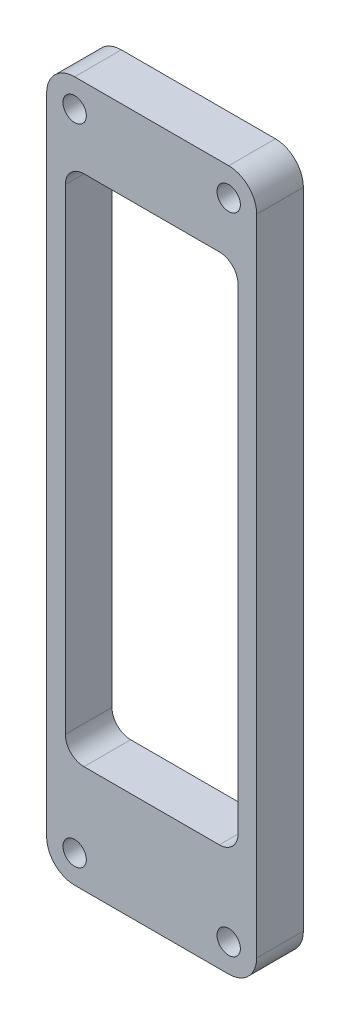
ISO-10303-21;
HEADER;
FILE_DESCRIPTION(('STEP AP214'),'2;1');
FILE_NAME('part.step','',(''),(''),'','','');
FILE_SCHEMA(('AUTOMOTIVE_DESIGN { 1 0 10303 214 1 1 1 1 }'));
ENDSEC;
DATA;
#1=APPLICATION_CONTEXT('core data for automotive mechanical design processes');
#2=APPLICATION_PROTOCOL_DEFINITION('international standard','automotive_design',2000,#1);
#3=PRODUCT_CONTEXT('',#1,'mechanical');
#4=PRODUCT('Part','Part','',(#3));
#5=PRODUCT_RELATED_PRODUCT_CATEGORY('part','',(#4));
#6=PRODUCT_DEFINITION_FORMATION('','',#4);
#7=PRODUCT_DEFINITION_CONTEXT('part definition',#1,'design');
#8=PRODUCT_DEFINITION('design','',#6,#7);
#9=PRODUCT_DEFINITION_SHAPE('','',#8);
#10=(LENGTH_UNIT() NAMED_UNIT(*) SI_UNIT(.MILLI.,.METRE.));
#11=(NAMED_UNIT(*) PLANE_ANGLE_UNIT() SI_UNIT($,.RADIAN.));
#12=(NAMED_UNIT(*) SI_UNIT($,.STERADIAN.) SOLID_ANGLE_UNIT());
#13=UNCERTAINTY_MEASURE_WITH_UNIT(LENGTH_MEASURE(1.E-05),#10,'distance_accuracy_value','');
#14=(GEOMETRIC_REPRESENTATION_CONTEXT(3) GLOBAL_UNCERTAINTY_ASSIGNED_CONTEXT((#13)) GLOBAL_UNIT_ASSIGNED_CONTEXT((#10,
#11,#12)) REPRESENTATION_CONTEXT('',''));
#15=CARTESIAN_POINT('',(0.,0.,0.));
#16=DIRECTION('',(0.,0.,1.));
#17=DIRECTION('',(1.,0.,0.));
#18=AXIS2_PLACEMENT_3D('',#15,#16,#17);
#19=CARTESIAN_POINT('',(13.7368421052632,-33.8684210526316,10.));
#20=DIRECTION('',(0.,0.,-1.));
#21=DIRECTION('',(-1.,0.,0.));
#22=AXIS2_PLACEMENT_3D('',#19,#20,#21);
#23=PLANE('',#22);
#24=DIRECTION('',(1.,0.,0.));
#25=VECTOR('',#24,1.);
#26=CARTESIAN_POINT('',(-17.2631578947368,-16.8684210526316,10.));
#27=LINE('',#26,#25);
#28=CARTESIAN_POINT('',(-17.2631578947368,-16.8684210526316,10.));
#29=VERTEX_POINT('',#28);
#30=CARTESIAN_POINT('',(11.7368421052631,-16.8684210526316,10.));
#31=VERTEX_POINT('',#30);
#32=EDGE_CURVE('E203',#29,#31,#27,.T.);
#33=ORIENTED_EDGE('',*,*,#32,.F.);
#34=CARTESIAN_POINT('',(-17.2631578947368,-12.8684210526316,10.));
#35=DIRECTION('',(0.,0.,1.));
#36=DIRECTION('',(1.,0.,0.));
#37=AXIS2_PLACEMENT_3D('',#34,#35,#36);
#38=CIRCLE('',#37,4.);
#39=CARTESIAN_POINT('',(-21.2631578947368,-12.8684210526315,10.));
#40=VERTEX_POINT('',#39);
#41=EDGE_CURVE('E55',#40,#29,#38,.T.);
#42=ORIENTED_EDGE('',*,*,#41,.F.);
#43=DIRECTION('',(0.,-1.,0.));
#44=VECTOR('',#43,1.);
#45=CARTESIAN_POINT('',(-21.2631578947368,89.1315789473684,10.));
#46=LINE('',#45,#44);
#47=CARTESIAN_POINT('',(-21.2631578947368,89.1315789473684,10.));
#48=VERTEX_POINT('',#47);
#49=EDGE_CURVE('E175',#48,#40,#46,.T.);
#50=ORIENTED_EDGE('',*,*,#49,.F.);
#51=CARTESIAN_POINT('',(-17.2631578947368,89.1315789473684,10.));
#52=DIRECTION('',(0.,0.,1.));
#53=DIRECTION('',(-1.,0.,0.));
#54=AXIS2_PLACEMENT_3D('',#51,#52,#53);
#55=CIRCLE('',#54,4.);
#56=CARTESIAN_POINT('',(-17.2631578947368,93.1315789473684,10.));
#57=VERTEX_POINT('',#56);
#58=EDGE_CURVE('E179',#57,#48,#55,.T.);
#59=ORIENTED_EDGE('',*,*,#58,.F.);
#60=DIRECTION('',(-1.,0.,0.));
#61=VECTOR('',#60,1.);
#62=CARTESIAN_POINT('',(-17.2631578947368,93.1315789473684,10.));
#63=LINE('',#62,#61);
#64=CARTESIAN_POINT('',(11.7368421052631,93.1315789473684,10.));
#65=VERTEX_POINT('',#64);
#66=EDGE_CURVE('E218',#65,#57,#63,.T.);
#67=ORIENTED_EDGE('',*,*,#66,.F.);
#68=CARTESIAN_POINT('',(11.7368421052632,89.1315789473684,10.));
#69=DIRECTION('',(0.,0.,1.));
#70=DIRECTION('',(1.,0.,0.));
#71=AXIS2_PLACEMENT_3D('',#68,#69,#70);
#72=CIRCLE('',#71,4.);
#73=CARTESIAN_POINT('',(15.7368421052632,89.1315789473684,10.));
#74=VERTEX_POINT('',#73);
#75=EDGE_CURVE('E214',#74,#65,#72,.T.);
#76=ORIENTED_EDGE('',*,*,#75,.F.);
#77=DIRECTION('',(0.,1.,0.));
#78=VECTOR('',#77,1.);
#79=CARTESIAN_POINT('',(15.7368421052632,89.1315789473684,10.));
#80=LINE('',#79,#78);
#81=CARTESIAN_POINT('',(15.7368421052632,-12.8684210526315,10.));
#82=VERTEX_POINT('',#81);
#83=EDGE_CURVE('E210',#82,#74,#80,.T.);
#84=ORIENTED_EDGE('',*,*,#83,.F.);
#85=CARTESIAN_POINT('',(11.7368421052632,-12.8684210526316,10.));
#86=DIRECTION('',(0.,0.,1.));
#87=DIRECTION('',(1.,0.,0.));
#88=AXIS2_PLACEMENT_3D('',#85,#86,#87);
#89=CIRCLE('',#88,4.);
#90=EDGE_CURVE('E206',#31,#82,#89,.T.);
#91=ORIENTED_EDGE('',*,*,#90,.F.);
#92=EDGE_LOOP('',(#33,#42,#50,#59,#67,#76,#84,#91));
#93=FACE_BOUND('',#92,.T.);
#94=CARTESIAN_POINT('',(13.7368421052632,-33.8684210526316,10.));
#95=DIRECTION('',(0.,0.,1.));
#96=DIRECTION('',(-1.,0.,0.));
#97=AXIS2_PLACEMENT_3D('',#94,#95,#96);
#98=CIRCLE('',#97,6.);
#99=CARTESIAN_POINT('',(13.7368421052631,-39.8684210526316,10.));
#100=VERTEX_POINT('',#99);
#101=CARTESIAN_POINT('',(19.7368421052632,-33.8684210526315,10.));
#102=VERTEX_POINT('',#101);
#103=EDGE_CURVE('E278',#100,#102,#98,.T.);
#104=ORIENTED_EDGE('',*,*,#103,.T.);
#105=DIRECTION('',(0.,1.,0.));
#106=VECTOR('',#105,1.);
#107=CARTESIAN_POINT('',(19.7368421052631,104.131578947368,10.));
#108=LINE('',#107,#106);
#109=CARTESIAN_POINT('',(19.7368421052631,104.131578947368,10.));
#110=VERTEX_POINT('',#109);
#111=EDGE_CURVE('E282',#102,#110,#108,.T.);
#112=ORIENTED_EDGE('',*,*,#111,.T.);
#113=CARTESIAN_POINT('',(13.7368421052631,104.131578947368,10.));
#114=DIRECTION('',(0.,0.,1.));
#115=DIRECTION('',(1.,0.,0.));
#116=AXIS2_PLACEMENT_3D('',#113,#114,#115);
#117=CIRCLE('',#116,6.);
#118=CARTESIAN_POINT('',(13.7368421052631,110.131578947368,10.));
#119=VERTEX_POINT('',#118);
#120=EDGE_CURVE('E286',#110,#119,#117,.T.);
#121=ORIENTED_EDGE('',*,*,#120,.T.);
#122=DIRECTION('',(-1.,0.,0.));
#123=VECTOR('',#122,1.);
#124=CARTESIAN_POINT('',(-19.2631578947368,110.131578947368,10.));
#125=LINE('',#124,#123);
#126=CARTESIAN_POINT('',(-19.2631578947368,110.131578947368,10.));
#127=VERTEX_POINT('',#126);
#128=EDGE_CURVE('E289',#119,#127,#125,.T.);
#129=ORIENTED_EDGE('',*,*,#128,.T.);
#130=CARTESIAN_POINT('',(-19.2631578947368,104.131578947368,10.));
#131=DIRECTION('',(0.,0.,1.));
#132=DIRECTION('',(1.,0.,0.));
#133=AXIS2_PLACEMENT_3D('',#130,#131,#132);
#134=CIRCLE('',#133,6.);
#135=CARTESIAN_POINT('',(-25.2631578947368,104.131578947368,10.));
#136=VERTEX_POINT('',#135);
#137=EDGE_CURVE('E292',#127,#136,#134,.T.);
#138=ORIENTED_EDGE('',*,*,#137,.T.);
#139=DIRECTION('',(0.,-1.,0.));
#140=VECTOR('',#139,1.);
#141=CARTESIAN_POINT('',(-25.2631578947368,104.131578947368,10.));
#142=LINE('',#141,#140);
#143=CARTESIAN_POINT('',(-25.2631578947368,-33.8684210526315,10.));
#144=VERTEX_POINT('',#143);
#145=EDGE_CURVE('E295',#136,#144,#142,.T.);
#146=ORIENTED_EDGE('',*,*,#145,.T.);
#147=CARTESIAN_POINT('',(-19.2631578947368,-33.8684210526316,10.));
#148=DIRECTION('',(0.,0.,1.));
#149=DIRECTION('',(-1.,0.,0.));
#150=AXIS2_PLACEMENT_3D('',#147,#148,#149);
#151=CIRCLE('',#150,6.);
#152=CARTESIAN_POINT('',(-19.2631578947368,-39.8684210526316,10.));
#153=VERTEX_POINT('',#152);
#154=EDGE_CURVE('E298',#144,#153,#151,.T.);
#155=ORIENTED_EDGE('',*,*,#154,.T.);
#156=DIRECTION('',(1.,0.,0.));
#157=VECTOR('',#156,1.);
#158=CARTESIAN_POINT('',(-19.2631578947368,-39.8684210526316,10.));
#159=LINE('',#158,#157);
#160=EDGE_CURVE('E301',#153,#100,#159,.T.);
#161=ORIENTED_EDGE('',*,*,#160,.T.);
#162=EDGE_LOOP('',(#104,#112,#121,#129,#138,#146,#155,#161));
#163=FACE_BOUND('',#162,.T.);
#164=CARTESIAN_POINT('',(-19.2631578947368,104.131578947368,10.));
#165=DIRECTION('',(0.,0.,1.));
#166=DIRECTION('',(1.,0.,0.));
#167=AXIS2_PLACEMENT_3D('',#164,#165,#166);
#168=CIRCLE('',#167,2.5);
#169=CARTESIAN_POINT('',(-16.7631578947368,104.131578947368,10.));
#170=VERTEX_POINT('',#169);
#171=EDGE_CURVE('E270',#170,#170,#168,.T.);
#172=ORIENTED_EDGE('',*,*,#171,.F.);
#173=EDGE_LOOP('',(#172));
#174=FACE_BOUND('',#173,.T.);
#175=CARTESIAN_POINT('',(13.7368421052631,104.131578947368,10.));
#176=DIRECTION('',(0.,0.,1.));
#177=DIRECTION('',(1.,0.,0.));
#178=AXIS2_PLACEMENT_3D('',#175,#176,#177);
#179=CIRCLE('',#178,2.5);
#180=CARTESIAN_POINT('',(16.2368421052631,104.131578947368,10.));
#181=VERTEX_POINT('',#180);
#182=EDGE_CURVE('E262',#181,#181,#179,.T.);
#183=ORIENTED_EDGE('',*,*,#182,.F.);
#184=EDGE_LOOP('',(#183));
#185=FACE_BOUND('',#184,.T.);
#186=CARTESIAN_POINT('',(-19.2631578947368,-33.8684210526316,10.));
#187=DIRECTION('',(0.,0.,1.));
#188=DIRECTION('',(1.,0.,0.));
#189=AXIS2_PLACEMENT_3D('',#186,#187,#188);
#190=CIRCLE('',#189,2.5);
#191=CARTESIAN_POINT('',(-16.7631578947368,-33.8684210526316,10.));
#192=VERTEX_POINT('',#191);
#193=EDGE_CURVE('E254',#192,#192,#190,.T.);
#194=ORIENTED_EDGE('',*,*,#193,.F.);
#195=EDGE_LOOP('',(#194));
#196=FACE_BOUND('',#195,.T.);
#197=CARTESIAN_POINT('',(13.7368421052632,-33.8684210526316,10.));
#198=DIRECTION('',(0.,0.,1.));
#199=DIRECTION('',(1.,0.,0.));
#200=AXIS2_PLACEMENT_3D('',#197,#198,#199);
#201=CIRCLE('',#200,2.5);
#202=CARTESIAN_POINT('',(16.2368421052632,-33.8684210526316,10.));
#203=VERTEX_POINT('',#202);
#204=EDGE_CURVE('E246',#203,#203,#201,.T.);
#205=ORIENTED_EDGE('',*,*,#204,.F.);
#206=EDGE_LOOP('',(#205));
#207=FACE_BOUND('',#206,.T.);
#208=ADVANCED_FACE('F39',(#93,#163,#174,#185,#196,#207),#23,.F.);
#209=CARTESIAN_POINT('',(13.7368421052632,-33.8684210526316,0.));
#210=DIRECTION('',(0.,0.,-1.));
#211=DIRECTION('',(-1.,0.,0.));
#212=AXIS2_PLACEMENT_3D('',#209,#210,#211);
#213=PLANE('',#212);
#214=CARTESIAN_POINT('',(-17.2631578947368,-12.8684210526316,0.));
#215=DIRECTION('',(0.,0.,1.));
#216=DIRECTION('',(1.,0.,0.));
#217=AXIS2_PLACEMENT_3D('',#214,#215,#216);
#218=CIRCLE('',#217,4.);
#219=CARTESIAN_POINT('',(-21.2631578947368,-12.8684210526315,0.));
#220=VERTEX_POINT('',#219);
#221=CARTESIAN_POINT('',(-17.2631578947368,-16.8684210526316,0.));
#222=VERTEX_POINT('',#221);
#223=EDGE_CURVE('E155',#220,#222,#218,.T.);
#224=ORIENTED_EDGE('',*,*,#223,.T.);
#225=DIRECTION('',(1.,0.,0.));
#226=VECTOR('',#225,1.);
#227=CARTESIAN_POINT('',(-17.2631578947368,-16.8684210526316,0.));
#228=LINE('',#227,#226);
#229=CARTESIAN_POINT('',(11.7368421052631,-16.8684210526316,0.));
#230=VERTEX_POINT('',#229);
#231=EDGE_CURVE('E165',#222,#230,#228,.T.);
#232=ORIENTED_EDGE('',*,*,#231,.T.);
#233=CARTESIAN_POINT('',(11.7368421052632,-12.8684210526316,0.));
#234=DIRECTION('',(0.,0.,1.));
#235=DIRECTION('',(1.,0.,0.));
#236=AXIS2_PLACEMENT_3D('',#233,#234,#235);
#237=CIRCLE('',#236,4.);
#238=CARTESIAN_POINT('',(15.7368421052632,-12.8684210526315,0.));
#239=VERTEX_POINT('',#238);
#240=EDGE_CURVE('E63',#230,#239,#237,.T.);
#241=ORIENTED_EDGE('',*,*,#240,.T.);
#242=DIRECTION('',(0.,1.,0.));
#243=VECTOR('',#242,1.);
#244=CARTESIAN_POINT('',(15.7368421052632,89.1315789473684,0.));
#245=LINE('',#244,#243);
#246=CARTESIAN_POINT('',(15.7368421052632,89.1315789473684,0.));
#247=VERTEX_POINT('',#246);
#248=EDGE_CURVE('E184',#239,#247,#245,.T.);
#249=ORIENTED_EDGE('',*,*,#248,.T.);
#250=CARTESIAN_POINT('',(11.7368421052632,89.1315789473684,0.));
#251=DIRECTION('',(0.,0.,1.));
#252=DIRECTION('',(1.,0.,0.));
#253=AXIS2_PLACEMENT_3D('',#250,#251,#252);
#254=CIRCLE('',#253,4.);
#255=CARTESIAN_POINT('',(11.7368421052631,93.1315789473684,0.));
#256=VERTEX_POINT('',#255);
#257=EDGE_CURVE('E188',#247,#256,#254,.T.);
#258=ORIENTED_EDGE('',*,*,#257,.T.);
#259=DIRECTION('',(-1.,0.,0.));
#260=VECTOR('',#259,1.);
#261=CARTESIAN_POINT('',(-17.2631578947368,93.1315789473684,0.));
#262=LINE('',#261,#260);
#263=CARTESIAN_POINT('',(-17.2631578947368,93.1315789473684,0.));
#264=VERTEX_POINT('',#263);
#265=EDGE_CURVE('E192',#256,#264,#262,.T.);
#266=ORIENTED_EDGE('',*,*,#265,.T.);
#267=CARTESIAN_POINT('',(-17.2631578947368,89.1315789473684,0.));
#268=DIRECTION('',(0.,0.,1.));
#269=DIRECTION('',(-1.,0.,0.));
#270=AXIS2_PLACEMENT_3D('',#267,#268,#269);
#271=CIRCLE('',#270,4.);
#272=CARTESIAN_POINT('',(-21.2631578947368,89.1315789473684,0.));
#273=VERTEX_POINT('',#272);
#274=EDGE_CURVE('E196',#264,#273,#271,.T.);
#275=ORIENTED_EDGE('',*,*,#274,.T.);
#276=DIRECTION('',(0.,-1.,0.));
#277=VECTOR('',#276,1.);
#278=CARTESIAN_POINT('',(-21.2631578947368,89.1315789473684,0.));
#279=LINE('',#278,#277);
#280=EDGE_CURVE('E162',#273,#220,#279,.T.);
#281=ORIENTED_EDGE('',*,*,#280,.T.);
#282=EDGE_LOOP('',(#224,#232,#241,#249,#258,#266,#275,#281));
#283=FACE_BOUND('',#282,.T.);
#284=CARTESIAN_POINT('',(-19.2631578947368,-33.8684210526316,0.));
#285=DIRECTION('',(0.,0.,1.));
#286=DIRECTION('',(1.,0.,0.));
#287=AXIS2_PLACEMENT_3D('',#284,#285,#286);
#288=CIRCLE('',#287,2.5);
#289=CARTESIAN_POINT('',(-16.7631578947368,-33.8684210526316,0.));
#290=VERTEX_POINT('',#289);
#291=EDGE_CURVE('E250',#290,#290,#288,.T.);
#292=ORIENTED_EDGE('',*,*,#291,.T.);
#293=EDGE_LOOP('',(#292));
#294=FACE_BOUND('',#293,.T.);
#295=CARTESIAN_POINT('',(-19.2631578947368,104.131578947368,0.));
#296=DIRECTION('',(0.,0.,1.));
#297=DIRECTION('',(1.,0.,0.));
#298=AXIS2_PLACEMENT_3D('',#295,#296,#297);
#299=CIRCLE('',#298,2.5);
#300=CARTESIAN_POINT('',(-16.7631578947368,104.131578947368,0.));
#301=VERTEX_POINT('',#300);
#302=EDGE_CURVE('E266',#301,#301,#299,.T.);
#303=ORIENTED_EDGE('',*,*,#302,.T.);
#304=EDGE_LOOP('',(#303));
#305=FACE_BOUND('',#304,.T.);
#306=CARTESIAN_POINT('',(13.7368421052632,-33.8684210526316,0.));
#307=DIRECTION('',(0.,0.,1.));
#308=DIRECTION('',(-1.,0.,0.));
#309=AXIS2_PLACEMENT_3D('',#306,#307,#308);
#310=CIRCLE('',#309,6.);
#311=CARTESIAN_POINT('',(13.7368421052631,-39.8684210526316,0.));
#312=VERTEX_POINT('',#311);
#313=CARTESIAN_POINT('',(19.7368421052632,-33.8684210526315,0.));
#314=VERTEX_POINT('',#313);
#315=EDGE_CURVE('E274',#312,#314,#310,.T.);
#316=ORIENTED_EDGE('',*,*,#315,.F.);
#317=DIRECTION('',(1.,0.,0.));
#318=VECTOR('',#317,1.);
#319=CARTESIAN_POINT('',(-19.2631578947368,-39.8684210526316,0.));
#320=LINE('',#319,#318);
#321=CARTESIAN_POINT('',(-19.2631578947368,-39.8684210526316,0.));
#322=VERTEX_POINT('',#321);
#323=EDGE_CURVE('E283',#322,#312,#320,.T.);
#324=ORIENTED_EDGE('',*,*,#323,.F.);
#325=CARTESIAN_POINT('',(-19.2631578947368,-33.8684210526316,0.));
#326=DIRECTION('',(0.,0.,1.));
#327=DIRECTION('',(-1.,0.,0.));
#328=AXIS2_PLACEMENT_3D('',#325,#326,#327);
#329=CIRCLE('',#328,6.);
#330=CARTESIAN_POINT('',(-25.2631578947368,-33.8684210526315,0.));
#331=VERTEX_POINT('',#330);
#332=EDGE_CURVE('E323',#331,#322,#329,.T.);
#333=ORIENTED_EDGE('',*,*,#332,.F.);
#334=DIRECTION('',(0.,-1.,0.));
#335=VECTOR('',#334,1.);
#336=CARTESIAN_POINT('',(-25.2631578947368,104.131578947368,0.));
#337=LINE('',#336,#335);
#338=CARTESIAN_POINT('',(-25.2631578947368,104.131578947368,0.));
#339=VERTEX_POINT('',#338);
#340=EDGE_CURVE('E320',#339,#331,#337,.T.);
#341=ORIENTED_EDGE('',*,*,#340,.F.);
#342=CARTESIAN_POINT('',(-19.2631578947368,104.131578947368,0.));
#343=DIRECTION('',(0.,0.,1.));
#344=DIRECTION('',(1.,0.,0.));
#345=AXIS2_PLACEMENT_3D('',#342,#343,#344);
#346=CIRCLE('',#345,6.);
#347=CARTESIAN_POINT('',(-19.2631578947368,110.131578947368,0.));
#348=VERTEX_POINT('',#347);
#349=EDGE_CURVE('E317',#348,#339,#346,.T.);
#350=ORIENTED_EDGE('',*,*,#349,.F.);
#351=DIRECTION('',(-1.,0.,0.));
#352=VECTOR('',#351,1.);
#353=CARTESIAN_POINT('',(-19.2631578947368,110.131578947368,0.));
#354=LINE('',#353,#352);
#355=CARTESIAN_POINT('',(13.7368421052631,110.131578947368,0.));
#356=VERTEX_POINT('',#355);
#357=EDGE_CURVE('E314',#356,#348,#354,.T.);
#358=ORIENTED_EDGE('',*,*,#357,.F.);
#359=CARTESIAN_POINT('',(13.7368421052631,104.131578947368,0.));
#360=DIRECTION('',(0.,0.,1.));
#361=DIRECTION('',(1.,0.,0.));
#362=AXIS2_PLACEMENT_3D('',#359,#360,#361);
#363=CIRCLE('',#362,6.);
#364=CARTESIAN_POINT('',(19.7368421052631,104.131578947368,0.));
#365=VERTEX_POINT('',#364);
#366=EDGE_CURVE('E311',#365,#356,#363,.T.);
#367=ORIENTED_EDGE('',*,*,#366,.F.);
#368=DIRECTION('',(0.,1.,0.));
#369=VECTOR('',#368,1.);
#370=CARTESIAN_POINT('',(19.7368421052631,104.131578947368,0.));
#371=LINE('',#370,#369);
#372=EDGE_CURVE('E308',#314,#365,#371,.T.);
#373=ORIENTED_EDGE('',*,*,#372,.F.);
#374=EDGE_LOOP('',(#316,#324,#333,#341,#350,#358,#367,#373));
#375=FACE_BOUND('',#374,.T.);
#376=CARTESIAN_POINT('',(13.7368421052631,104.131578947368,0.));
#377=DIRECTION('',(0.,0.,1.));
#378=DIRECTION('',(1.,0.,0.));
#379=AXIS2_PLACEMENT_3D('',#376,#377,#378);
#380=CIRCLE('',#379,2.5);
#381=CARTESIAN_POINT('',(16.2368421052631,104.131578947368,0.));
#382=VERTEX_POINT('',#381);
#383=EDGE_CURVE('E258',#382,#382,#380,.T.);
#384=ORIENTED_EDGE('',*,*,#383,.T.);
#385=EDGE_LOOP('',(#384));
#386=FACE_BOUND('',#385,.T.);
#387=CARTESIAN_POINT('',(13.7368421052632,-33.8684210526316,0.));
#388=DIRECTION('',(0.,0.,1.));
#389=DIRECTION('',(1.,0.,0.));
#390=AXIS2_PLACEMENT_3D('',#387,#388,#389);
#391=CIRCLE('',#390,2.5);
#392=CARTESIAN_POINT('',(16.2368421052632,-33.8684210526316,0.));
#393=VERTEX_POINT('',#392);
#394=EDGE_CURVE('E228',#393,#393,#391,.T.);
#395=ORIENTED_EDGE('',*,*,#394,.T.);
#396=EDGE_LOOP('',(#395));
#397=FACE_BOUND('',#396,.T.);
#398=ADVANCED_FACE('F170',(#283,#294,#305,#375,#386,#397),#213,.T.);
#399=CARTESIAN_POINT('',(13.7368421052632,-33.8684210526316,10.));
#400=DIRECTION('',(0.,0.,-1.));
#401=DIRECTION('',(-1.,0.,0.));
#402=AXIS2_PLACEMENT_3D('',#399,#400,#401);
#403=CYLINDRICAL_SURFACE('',#402,6.);
#404=ORIENTED_EDGE('',*,*,#315,.T.);
#405=DIRECTION('',(0.,0.,-1.));
#406=VECTOR('',#405,1.);
#407=CARTESIAN_POINT('',(19.7368421052632,-33.8684210526315,10.));
#408=LINE('',#407,#406);
#409=EDGE_CURVE('E11',#102,#314,#408,.T.);
#410=ORIENTED_EDGE('',*,*,#409,.F.);
#411=ORIENTED_EDGE('',*,*,#103,.F.);
#412=DIRECTION('',(0.,0.,-1.));
#413=VECTOR('',#412,1.);
#414=CARTESIAN_POINT('',(13.7368421052631,-39.8684210526316,10.));
#415=LINE('',#414,#413);
#416=EDGE_CURVE('E304',#100,#312,#415,.T.);
#417=ORIENTED_EDGE('',*,*,#416,.T.);
#418=EDGE_LOOP('',(#404,#410,#411,#417));
#419=FACE_BOUND('',#418,.T.);
#420=ADVANCED_FACE('F41',(#419),#403,.T.);
#421=CARTESIAN_POINT('',(19.7368421052631,104.131578947368,10.));
#422=DIRECTION('',(-1.,0.,0.));
#423=DIRECTION('',(0.,-1.,0.));
#424=AXIS2_PLACEMENT_3D('',#421,#422,#423);
#425=PLANE('',#424);
#426=ORIENTED_EDGE('',*,*,#372,.T.);
#427=DIRECTION('',(0.,0.,-1.));
#428=VECTOR('',#427,1.);
#429=CARTESIAN_POINT('',(19.7368421052631,104.131578947368,10.));
#430=LINE('',#429,#428);
#431=EDGE_CURVE('E48',#110,#365,#430,.T.);
#432=ORIENTED_EDGE('',*,*,#431,.F.);
#433=ORIENTED_EDGE('',*,*,#111,.F.);
#434=ORIENTED_EDGE('',*,*,#409,.T.);
#435=EDGE_LOOP('',(#426,#432,#433,#434));
#436=FACE_BOUND('',#435,.T.);
#437=ADVANCED_FACE('F379',(#436),#425,.F.);
#438=CARTESIAN_POINT('',(13.7368421052631,104.131578947368,10.));
#439=DIRECTION('',(0.,0.,-1.));
#440=DIRECTION('',(-1.,0.,0.));
#441=AXIS2_PLACEMENT_3D('',#438,#439,#440);
#442=CYLINDRICAL_SURFACE('',#441,6.);
#443=ORIENTED_EDGE('',*,*,#366,.T.);
#444=DIRECTION('',(0.,0.,-1.));
#445=VECTOR('',#444,1.);
#446=CARTESIAN_POINT('',(13.7368421052631,110.131578947368,10.));
#447=LINE('',#446,#445);
#448=EDGE_CURVE('E347',#119,#356,#447,.T.);
#449=ORIENTED_EDGE('',*,*,#448,.F.);
#450=ORIENTED_EDGE('',*,*,#120,.F.);
#451=ORIENTED_EDGE('',*,*,#431,.T.);
#452=EDGE_LOOP('',(#443,#449,#450,#451));
#453=FACE_BOUND('',#452,.T.);
#454=ADVANCED_FACE('F356',(#453),#442,.T.);
#455=CARTESIAN_POINT('',(-19.2631578947368,110.131578947368,10.));
#456=DIRECTION('',(0.,-1.,0.));
#457=DIRECTION('',(0.,0.,-1.));
#458=AXIS2_PLACEMENT_3D('',#455,#456,#457);
#459=PLANE('',#458);
#460=ORIENTED_EDGE('',*,*,#357,.T.);
#461=DIRECTION('',(0.,0.,-1.));
#462=VECTOR('',#461,1.);
#463=CARTESIAN_POINT('',(-19.2631578947368,110.131578947368,10.));
#464=LINE('',#463,#462);
#465=EDGE_CURVE('E343',#127,#348,#464,.T.);
#466=ORIENTED_EDGE('',*,*,#465,.F.);
#467=ORIENTED_EDGE('',*,*,#128,.F.);
#468=ORIENTED_EDGE('',*,*,#448,.T.);
#469=EDGE_LOOP('',(#460,#466,#467,#468));
#470=FACE_BOUND('',#469,.T.);
#471=ADVANCED_FACE('F367',(#470),#459,.F.);
#472=CARTESIAN_POINT('',(-19.2631578947368,104.131578947368,10.));
#473=DIRECTION('',(0.,0.,-1.));
#474=DIRECTION('',(-1.,0.,0.));
#475=AXIS2_PLACEMENT_3D('',#472,#473,#474);
#476=CYLINDRICAL_SURFACE('',#475,6.);
#477=ORIENTED_EDGE('',*,*,#349,.T.);
#478=DIRECTION('',(0.,0.,-1.));
#479=VECTOR('',#478,1.);
#480=CARTESIAN_POINT('',(-25.2631578947368,104.131578947368,10.));
#481=LINE('',#480,#479);
#482=EDGE_CURVE('E339',#136,#339,#481,.T.);
#483=ORIENTED_EDGE('',*,*,#482,.F.);
#484=ORIENTED_EDGE('',*,*,#137,.F.);
#485=ORIENTED_EDGE('',*,*,#465,.T.);
#486=EDGE_LOOP('',(#477,#483,#484,#485));
#487=FACE_BOUND('',#486,.T.);
#488=ADVANCED_FACE('F371',(#487),#476,.T.);
#489=CARTESIAN_POINT('',(-25.2631578947368,104.131578947368,10.));
#490=DIRECTION('',(1.,0.,0.));
#491=DIRECTION('',(0.,1.,0.));
#492=AXIS2_PLACEMENT_3D('',#489,#490,#491);
#493=PLANE('',#492);
#494=ORIENTED_EDGE('',*,*,#340,.T.);
#495=DIRECTION('',(0.,0.,-1.));
#496=VECTOR('',#495,1.);
#497=CARTESIAN_POINT('',(-25.2631578947368,-33.8684210526315,10.));
#498=LINE('',#497,#496);
#499=EDGE_CURVE('E335',#144,#331,#498,.T.);
#500=ORIENTED_EDGE('',*,*,#499,.F.);
#501=ORIENTED_EDGE('',*,*,#145,.F.);
#502=ORIENTED_EDGE('',*,*,#482,.T.);
#503=EDGE_LOOP('',(#494,#500,#501,#502));
#504=FACE_BOUND('',#503,.T.);
#505=ADVANCED_FACE('F392',(#504),#493,.F.);
#506=CARTESIAN_POINT('',(-19.2631578947368,-33.8684210526316,10.));
#507=DIRECTION('',(0.,0.,-1.));
#508=DIRECTION('',(-1.,0.,0.));
#509=AXIS2_PLACEMENT_3D('',#506,#507,#508);
#510=CYLINDRICAL_SURFACE('',#509,6.);
#511=ORIENTED_EDGE('',*,*,#332,.T.);
#512=DIRECTION('',(0.,0.,-1.));
#513=VECTOR('',#512,1.);
#514=CARTESIAN_POINT('',(-19.2631578947368,-39.8684210526316,10.));
#515=LINE('',#514,#513);
#516=EDGE_CURVE('E331',#153,#322,#515,.T.);
#517=ORIENTED_EDGE('',*,*,#516,.F.);
#518=ORIENTED_EDGE('',*,*,#154,.F.);
#519=ORIENTED_EDGE('',*,*,#499,.T.);
#520=EDGE_LOOP('',(#511,#517,#518,#519));
#521=FACE_BOUND('',#520,.T.);
#522=ADVANCED_FACE('F390',(#521),#510,.T.);
#523=CARTESIAN_POINT('',(-19.2631578947368,-39.8684210526316,10.));
#524=DIRECTION('',(0.,1.,0.));
#525=DIRECTION('',(0.,0.,1.));
#526=AXIS2_PLACEMENT_3D('',#523,#524,#525);
#527=PLANE('',#526);
#528=ORIENTED_EDGE('',*,*,#323,.T.);
#529=ORIENTED_EDGE('',*,*,#416,.F.);
#530=ORIENTED_EDGE('',*,*,#160,.F.);
#531=ORIENTED_EDGE('',*,*,#516,.T.);
#532=EDGE_LOOP('',(#528,#529,#530,#531));
#533=FACE_BOUND('',#532,.T.);
#534=ADVANCED_FACE('F385',(#533),#527,.F.);
#535=CARTESIAN_POINT('',(-19.2631578947368,104.131578947368,10.));
#536=DIRECTION('',(0.,0.,-1.));
#537=DIRECTION('',(-1.,0.,0.));
#538=AXIS2_PLACEMENT_3D('',#535,#536,#537);
#539=CYLINDRICAL_SURFACE('',#538,2.5);
#540=ORIENTED_EDGE('',*,*,#171,.T.);
#541=EDGE_LOOP('',(#540));
#542=FACE_BOUND('',#541,.T.);
#543=ORIENTED_EDGE('',*,*,#302,.F.);
#544=EDGE_LOOP('',(#543));
#545=FACE_BOUND('',#544,.T.);
#546=ADVANCED_FACE('F409',(#542,#545),#539,.F.);
#547=CARTESIAN_POINT('',(13.7368421052631,104.131578947368,10.));
#548=DIRECTION('',(0.,0.,-1.));
#549=DIRECTION('',(-1.,0.,0.));
#550=AXIS2_PLACEMENT_3D('',#547,#548,#549);
#551=CYLINDRICAL_SURFACE('',#550,2.5);
#552=ORIENTED_EDGE('',*,*,#182,.T.);
#553=EDGE_LOOP('',(#552));
#554=FACE_BOUND('',#553,.T.);
#555=ORIENTED_EDGE('',*,*,#383,.F.);
#556=EDGE_LOOP('',(#555));
#557=FACE_BOUND('',#556,.T.);
#558=ADVANCED_FACE('F416',(#554,#557),#551,.F.);
#559=CARTESIAN_POINT('',(-19.2631578947368,-33.8684210526316,10.));
#560=DIRECTION('',(0.,0.,-1.));
#561=DIRECTION('',(-1.,0.,0.));
#562=AXIS2_PLACEMENT_3D('',#559,#560,#561);
#563=CYLINDRICAL_SURFACE('',#562,2.5);
#564=ORIENTED_EDGE('',*,*,#193,.T.);
#565=EDGE_LOOP('',(#564));
#566=FACE_BOUND('',#565,.T.);
#567=ORIENTED_EDGE('',*,*,#291,.F.);
#568=EDGE_LOOP('',(#567));
#569=FACE_BOUND('',#568,.T.);
#570=ADVANCED_FACE('F421',(#566,#569),#563,.F.);
#571=CARTESIAN_POINT('',(13.7368421052632,-33.8684210526316,10.));
#572=DIRECTION('',(0.,0.,-1.));
#573=DIRECTION('',(-1.,0.,0.));
#574=AXIS2_PLACEMENT_3D('',#571,#572,#573);
#575=CYLINDRICAL_SURFACE('',#574,2.5);
#576=ORIENTED_EDGE('',*,*,#204,.T.);
#577=EDGE_LOOP('',(#576));
#578=FACE_BOUND('',#577,.T.);
#579=ORIENTED_EDGE('',*,*,#394,.F.);
#580=EDGE_LOOP('',(#579));
#581=FACE_BOUND('',#580,.T.);
#582=ADVANCED_FACE('F434',(#578,#581),#575,.F.);
#583=CARTESIAN_POINT('',(-17.2631578947368,-12.8684210526316,0.));
#584=DIRECTION('',(0.,0.,1.));
#585=DIRECTION('',(1.,0.,0.));
#586=AXIS2_PLACEMENT_3D('',#583,#584,#585);
#587=CYLINDRICAL_SURFACE('',#586,4.);
#588=ORIENTED_EDGE('',*,*,#41,.T.);
#589=DIRECTION('',(0.,0.,1.));
#590=VECTOR('',#589,1.);
#591=CARTESIAN_POINT('',(-17.2631578947368,-16.8684210526316,0.));
#592=LINE('',#591,#590);
#593=EDGE_CURVE('E151',#222,#29,#592,.T.);
#594=ORIENTED_EDGE('',*,*,#593,.F.);
#595=ORIENTED_EDGE('',*,*,#223,.F.);
#596=DIRECTION('',(0.,0.,1.));
#597=VECTOR('',#596,1.);
#598=CARTESIAN_POINT('',(-21.2631578947368,-12.8684210526315,0.));
#599=LINE('',#598,#597);
#600=EDGE_CURVE('E225',#220,#40,#599,.T.);
#601=ORIENTED_EDGE('',*,*,#600,.T.);
#602=EDGE_LOOP('',(#588,#594,#595,#601));
#603=FACE_BOUND('',#602,.T.);
#604=ADVANCED_FACE('F153',(#603),#587,.F.);
#605=CARTESIAN_POINT('',(-21.2631578947368,89.1315789473684,0.));
#606=DIRECTION('',(-1.,0.,0.));
#607=DIRECTION('',(0.,-1.,0.));
#608=AXIS2_PLACEMENT_3D('',#605,#606,#607);
#609=PLANE('',#608);
#610=ORIENTED_EDGE('',*,*,#49,.T.);
#611=ORIENTED_EDGE('',*,*,#600,.F.);
#612=ORIENTED_EDGE('',*,*,#280,.F.);
#613=DIRECTION('',(0.,0.,1.));
#614=VECTOR('',#613,1.);
#615=CARTESIAN_POINT('',(-21.2631578947368,89.1315789473684,0.));
#616=LINE('',#615,#614);
#617=EDGE_CURVE('E229',#273,#48,#616,.T.);
#618=ORIENTED_EDGE('',*,*,#617,.T.);
#619=EDGE_LOOP('',(#610,#611,#612,#618));
#620=FACE_BOUND('',#619,.T.);
#621=ADVANCED_FACE('F444',(#620),#609,.F.);
#622=CARTESIAN_POINT('',(-17.2631578947368,89.1315789473684,0.));
#623=DIRECTION('',(0.,0.,1.));
#624=DIRECTION('',(1.,0.,0.));
#625=AXIS2_PLACEMENT_3D('',#622,#623,#624);
#626=CYLINDRICAL_SURFACE('',#625,4.);
#627=ORIENTED_EDGE('',*,*,#58,.T.);
#628=ORIENTED_EDGE('',*,*,#617,.F.);
#629=ORIENTED_EDGE('',*,*,#274,.F.);
#630=DIRECTION('',(0.,0.,1.));
#631=VECTOR('',#630,1.);
#632=CARTESIAN_POINT('',(-17.2631578947368,93.1315789473684,0.));
#633=LINE('',#632,#631);
#634=EDGE_CURVE('E232',#264,#57,#633,.T.);
#635=ORIENTED_EDGE('',*,*,#634,.T.);
#636=EDGE_LOOP('',(#627,#628,#629,#635));
#637=FACE_BOUND('',#636,.T.);
#638=ADVANCED_FACE('F465',(#637),#626,.F.);
#639=CARTESIAN_POINT('',(-17.2631578947368,93.1315789473684,0.));
#640=DIRECTION('',(0.,1.,0.));
#641=DIRECTION('',(0.,0.,1.));
#642=AXIS2_PLACEMENT_3D('',#639,#640,#641);
#643=PLANE('',#642);
#644=ORIENTED_EDGE('',*,*,#66,.T.);
#645=ORIENTED_EDGE('',*,*,#634,.F.);
#646=ORIENTED_EDGE('',*,*,#265,.F.);
#647=DIRECTION('',(0.,0.,1.));
#648=VECTOR('',#647,1.);
#649=CARTESIAN_POINT('',(11.7368421052631,93.1315789473684,0.));
#650=LINE('',#649,#648);
#651=EDGE_CURVE('E235',#256,#65,#650,.T.);
#652=ORIENTED_EDGE('',*,*,#651,.T.);
#653=EDGE_LOOP('',(#644,#645,#646,#652));
#654=FACE_BOUND('',#653,.T.);
#655=ADVANCED_FACE('F461',(#654),#643,.F.);
#656=CARTESIAN_POINT('',(11.7368421052632,89.1315789473684,0.));
#657=DIRECTION('',(0.,0.,1.));
#658=DIRECTION('',(1.,0.,0.));
#659=AXIS2_PLACEMENT_3D('',#656,#657,#658);
#660=CYLINDRICAL_SURFACE('',#659,4.);
#661=ORIENTED_EDGE('',*,*,#75,.T.);
#662=ORIENTED_EDGE('',*,*,#651,.F.);
#663=ORIENTED_EDGE('',*,*,#257,.F.);
#664=DIRECTION('',(0.,0.,1.));
#665=VECTOR('',#664,1.);
#666=CARTESIAN_POINT('',(15.7368421052632,89.1315789473684,0.));
#667=LINE('',#666,#665);
#668=EDGE_CURVE('E238',#247,#74,#667,.T.);
#669=ORIENTED_EDGE('',*,*,#668,.T.);
#670=EDGE_LOOP('',(#661,#662,#663,#669));
#671=FACE_BOUND('',#670,.T.);
#672=ADVANCED_FACE('F457',(#671),#660,.F.);
#673=CARTESIAN_POINT('',(15.7368421052632,89.1315789473684,0.));
#674=DIRECTION('',(1.,0.,0.));
#675=DIRECTION('',(0.,1.,0.));
#676=AXIS2_PLACEMENT_3D('',#673,#674,#675);
#677=PLANE('',#676);
#678=ORIENTED_EDGE('',*,*,#83,.T.);
#679=ORIENTED_EDGE('',*,*,#668,.F.);
#680=ORIENTED_EDGE('',*,*,#248,.F.);
#681=DIRECTION('',(0.,0.,1.));
#682=VECTOR('',#681,1.);
#683=CARTESIAN_POINT('',(15.7368421052632,-12.8684210526315,0.));
#684=LINE('',#683,#682);
#685=EDGE_CURVE('E241',#239,#82,#684,.T.);
#686=ORIENTED_EDGE('',*,*,#685,.T.);
#687=EDGE_LOOP('',(#678,#679,#680,#686));
#688=FACE_BOUND('',#687,.T.);
#689=ADVANCED_FACE('F454',(#688),#677,.F.);
#690=CARTESIAN_POINT('',(11.7368421052632,-12.8684210526316,0.));
#691=DIRECTION('',(0.,0.,1.));
#692=DIRECTION('',(1.,0.,0.));
#693=AXIS2_PLACEMENT_3D('',#690,#691,#692);
#694=CYLINDRICAL_SURFACE('',#693,4.);
#695=ORIENTED_EDGE('',*,*,#90,.T.);
#696=ORIENTED_EDGE('',*,*,#685,.F.);
#697=ORIENTED_EDGE('',*,*,#240,.F.);
#698=DIRECTION('',(0.,0.,1.));
#699=VECTOR('',#698,1.);
#700=CARTESIAN_POINT('',(11.7368421052631,-16.8684210526316,0.));
#701=LINE('',#700,#699);
#702=EDGE_CURVE('E161',#230,#31,#701,.T.);
#703=ORIENTED_EDGE('',*,*,#702,.T.);
#704=EDGE_LOOP('',(#695,#696,#697,#703));
#705=FACE_BOUND('',#704,.T.);
#706=ADVANCED_FACE('F451',(#705),#694,.F.);
#707=CARTESIAN_POINT('',(-17.2631578947368,-16.8684210526316,0.));
#708=DIRECTION('',(0.,-1.,0.));
#709=DIRECTION('',(0.,0.,-1.));
#710=AXIS2_PLACEMENT_3D('',#707,#708,#709);
#711=PLANE('',#710);
#712=ORIENTED_EDGE('',*,*,#32,.T.);
#713=ORIENTED_EDGE('',*,*,#702,.F.);
#714=ORIENTED_EDGE('',*,*,#231,.F.);
#715=ORIENTED_EDGE('',*,*,#593,.T.);
#716=EDGE_LOOP('',(#712,#713,#714,#715));
#717=FACE_BOUND('',#716,.T.);
#718=ADVANCED_FACE('F166',(#717),#711,.F.);
#719=CLOSED_SHELL('',(#208,#398,#420,#437,#454,#471,#488,#505,#522,#534,#546,#558,#570,#582,
#604,#621,#638,#655,#672,#689,#706,#718));
#720=MANIFOLD_SOLID_BREP('B2',#719);
#721=ADVANCED_BREP_SHAPE_REPRESENTATION('',(#18,#720),#14);
#722=SHAPE_DEFINITION_REPRESENTATION(#9,#721);
ENDSEC;
END-ISO-10303-21;
